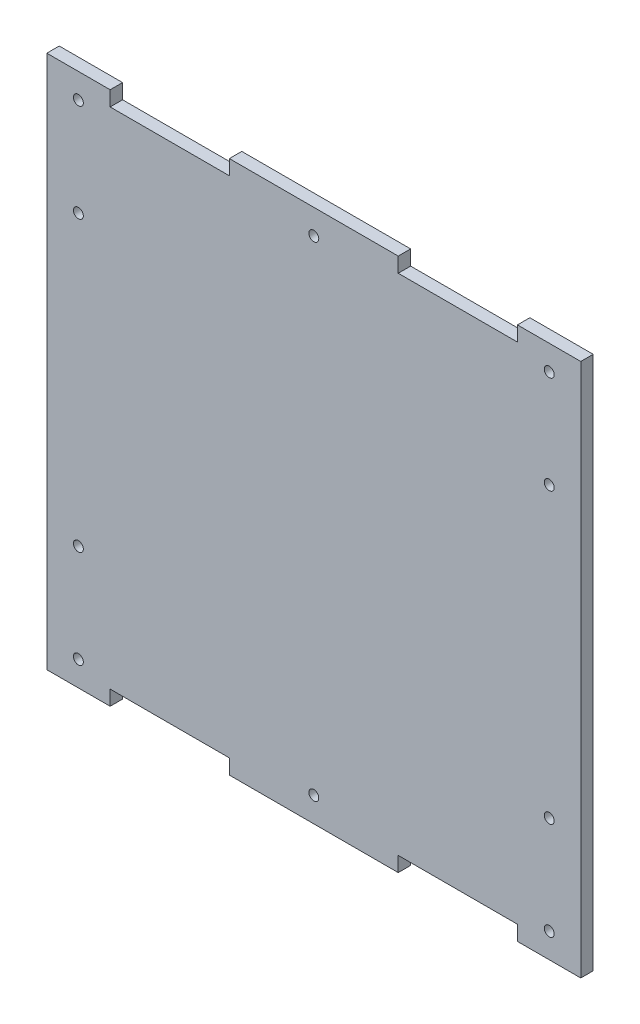
ISO-10303-21;
HEADER;
FILE_DESCRIPTION(('STEP AP214'),'2;1');
FILE_NAME('part.step','',(''),(''),'','','');
FILE_SCHEMA(('AUTOMOTIVE_DESIGN { 1 0 10303 214 1 1 1 1 }'));
ENDSEC;
DATA;
#1=APPLICATION_CONTEXT('core data for automotive mechanical design processes');
#2=APPLICATION_PROTOCOL_DEFINITION('international standard','automotive_design',2000,#1);
#3=PRODUCT_CONTEXT('',#1,'mechanical');
#4=PRODUCT('Part','Part','',(#3));
#5=PRODUCT_RELATED_PRODUCT_CATEGORY('part','',(#4));
#6=PRODUCT_DEFINITION_FORMATION('','',#4);
#7=PRODUCT_DEFINITION_CONTEXT('part definition',#1,'design');
#8=PRODUCT_DEFINITION('design','',#6,#7);
#9=PRODUCT_DEFINITION_SHAPE('','',#8);
#10=(LENGTH_UNIT() NAMED_UNIT(*) SI_UNIT(.MILLI.,.METRE.));
#11=(NAMED_UNIT(*) PLANE_ANGLE_UNIT() SI_UNIT($,.RADIAN.));
#12=(NAMED_UNIT(*) SI_UNIT($,.STERADIAN.) SOLID_ANGLE_UNIT());
#13=UNCERTAINTY_MEASURE_WITH_UNIT(LENGTH_MEASURE(1.E-05),#10,'distance_accuracy_value','');
#14=(GEOMETRIC_REPRESENTATION_CONTEXT(3) GLOBAL_UNCERTAINTY_ASSIGNED_CONTEXT((#13)) GLOBAL_UNIT_ASSIGNED_CONTEXT((#10,
#11,#12)) REPRESENTATION_CONTEXT('',''));
#15=CARTESIAN_POINT('',(0.,0.,0.));
#16=DIRECTION('',(0.,0.,1.));
#17=DIRECTION('',(1.,0.,0.));
#18=AXIS2_PLACEMENT_3D('',#15,#16,#17);
#19=CARTESIAN_POINT('',(-136.525,-136.525,6.35));
#20=DIRECTION('',(0.,1.,0.));
#21=DIRECTION('',(0.,0.,1.));
#22=AXIS2_PLACEMENT_3D('',#19,#20,#21);
#23=PLANE('',#22);
#24=DIRECTION('',(1.,0.,0.));
#25=VECTOR('',#24,1.);
#26=CARTESIAN_POINT('',(-136.525,-136.525,0.));
#27=LINE('',#26,#25);
#28=CARTESIAN_POINT('',(-43.1799999999999,-136.525,0.));
#29=VERTEX_POINT('',#28);
#30=CARTESIAN_POINT('',(43.18,-136.525,0.));
#31=VERTEX_POINT('',#30);
#32=EDGE_CURVE('E349',#29,#31,#27,.T.);
#33=ORIENTED_EDGE('',*,*,#32,.T.);
#34=DIRECTION('',(0.,0.,1.));
#35=VECTOR('',#34,1.);
#36=CARTESIAN_POINT('',(43.18,-136.525,6.35));
#37=LINE('',#36,#35);
#38=CARTESIAN_POINT('',(43.18,-136.525,6.35));
#39=VERTEX_POINT('',#38);
#40=EDGE_CURVE('E11',#31,#39,#37,.T.);
#41=ORIENTED_EDGE('',*,*,#40,.T.);
#42=DIRECTION('',(1.,0.,0.));
#43=VECTOR('',#42,1.);
#44=CARTESIAN_POINT('',(-136.525,-136.525,6.35));
#45=LINE('',#44,#43);
#46=CARTESIAN_POINT('',(-43.1799999999999,-136.525,6.35));
#47=VERTEX_POINT('',#46);
#48=EDGE_CURVE('E337',#47,#39,#45,.T.);
#49=ORIENTED_EDGE('',*,*,#48,.F.);
#50=DIRECTION('',(0.,0.,-1.));
#51=VECTOR('',#50,1.);
#52=CARTESIAN_POINT('',(-43.1799999999999,-136.525,6.35));
#53=LINE('',#52,#51);
#54=EDGE_CURVE('E373',#47,#29,#53,.T.);
#55=ORIENTED_EDGE('',*,*,#54,.T.);
#56=EDGE_LOOP('',(#33,#41,#49,#55));
#57=FACE_BOUND('',#56,.T.);
#58=ADVANCED_FACE('F31',(#57),#23,.F.);
#59=CARTESIAN_POINT('',(-136.525,-136.525,0.));
#60=VERTEX_POINT('',#59);
#61=CARTESIAN_POINT('',(-104.14,-136.525,0.));
#62=VERTEX_POINT('',#61);
#63=EDGE_CURVE('E325',#60,#62,#27,.T.);
#64=ORIENTED_EDGE('',*,*,#63,.T.);
#65=DIRECTION('',(0.,0.,1.));
#66=VECTOR('',#65,1.);
#67=CARTESIAN_POINT('',(-104.14,-136.525,6.35));
#68=LINE('',#67,#66);
#69=CARTESIAN_POINT('',(-104.14,-136.525,6.35));
#70=VERTEX_POINT('',#69);
#71=EDGE_CURVE('E375',#62,#70,#68,.T.);
#72=ORIENTED_EDGE('',*,*,#71,.T.);
#73=CARTESIAN_POINT('',(-136.525,-136.525,6.35));
#74=VERTEX_POINT('',#73);
#75=EDGE_CURVE('E333',#74,#70,#45,.T.);
#76=ORIENTED_EDGE('',*,*,#75,.F.);
#77=DIRECTION('',(0.,0.,-1.));
#78=VECTOR('',#77,1.);
#79=CARTESIAN_POINT('',(-136.525,-136.525,6.35));
#80=LINE('',#79,#78);
#81=EDGE_CURVE('E352',#74,#60,#80,.T.);
#82=ORIENTED_EDGE('',*,*,#81,.T.);
#83=EDGE_LOOP('',(#64,#72,#76,#82));
#84=FACE_BOUND('',#83,.T.);
#85=ADVANCED_FACE('F404',(#84),#23,.F.);
#86=CARTESIAN_POINT('',(-136.525,136.525,6.35));
#87=DIRECTION('',(0.,-1.,0.));
#88=DIRECTION('',(0.,0.,-1.));
#89=AXIS2_PLACEMENT_3D('',#86,#87,#88);
#90=PLANE('',#89);
#91=DIRECTION('',(-1.,0.,0.));
#92=VECTOR('',#91,1.);
#93=CARTESIAN_POINT('',(-136.525,136.525,0.));
#94=LINE('',#93,#92);
#95=CARTESIAN_POINT('',(136.525,136.525,0.));
#96=VERTEX_POINT('',#95);
#97=CARTESIAN_POINT('',(104.14,136.525,0.));
#98=VERTEX_POINT('',#97);
#99=EDGE_CURVE('E341',#96,#98,#94,.T.);
#100=ORIENTED_EDGE('',*,*,#99,.T.);
#101=DIRECTION('',(0.,0.,1.));
#102=VECTOR('',#101,1.);
#103=CARTESIAN_POINT('',(104.14,136.525,6.35));
#104=LINE('',#103,#102);
#105=CARTESIAN_POINT('',(104.14,136.525,6.35));
#106=VERTEX_POINT('',#105);
#107=EDGE_CURVE('E370',#98,#106,#104,.T.);
#108=ORIENTED_EDGE('',*,*,#107,.T.);
#109=DIRECTION('',(-1.,0.,0.));
#110=VECTOR('',#109,1.);
#111=CARTESIAN_POINT('',(-136.525,136.525,6.35));
#112=LINE('',#111,#110);
#113=CARTESIAN_POINT('',(136.525,136.525,6.35));
#114=VERTEX_POINT('',#113);
#115=EDGE_CURVE('E326',#114,#106,#112,.T.);
#116=ORIENTED_EDGE('',*,*,#115,.F.);
#117=DIRECTION('',(0.,0.,-1.));
#118=VECTOR('',#117,1.);
#119=CARTESIAN_POINT('',(136.525,136.525,6.35));
#120=LINE('',#119,#118);
#121=EDGE_CURVE('E358',#114,#96,#120,.T.);
#122=ORIENTED_EDGE('',*,*,#121,.T.);
#123=EDGE_LOOP('',(#100,#108,#116,#122));
#124=FACE_BOUND('',#123,.T.);
#125=ADVANCED_FACE('F439',(#124),#90,.F.);
#126=CARTESIAN_POINT('',(-104.14,136.525,6.35));
#127=VERTEX_POINT('',#126);
#128=CARTESIAN_POINT('',(-136.525,136.525,6.35));
#129=VERTEX_POINT('',#128);
#130=EDGE_CURVE('E324',#127,#129,#112,.T.);
#131=ORIENTED_EDGE('',*,*,#130,.F.);
#132=DIRECTION('',(0.,0.,-1.));
#133=VECTOR('',#132,1.);
#134=CARTESIAN_POINT('',(-104.14,136.525,6.35));
#135=LINE('',#134,#133);
#136=CARTESIAN_POINT('',(-104.14,136.525,0.));
#137=VERTEX_POINT('',#136);
#138=EDGE_CURVE('E364',#127,#137,#135,.T.);
#139=ORIENTED_EDGE('',*,*,#138,.T.);
#140=CARTESIAN_POINT('',(-136.525,136.525,0.));
#141=VERTEX_POINT('',#140);
#142=EDGE_CURVE('E340',#137,#141,#94,.T.);
#143=ORIENTED_EDGE('',*,*,#142,.T.);
#144=DIRECTION('',(0.,0.,-1.));
#145=VECTOR('',#144,1.);
#146=CARTESIAN_POINT('',(-136.525,136.525,6.35));
#147=LINE('',#146,#145);
#148=EDGE_CURVE('E355',#129,#141,#147,.T.);
#149=ORIENTED_EDGE('',*,*,#148,.F.);
#150=EDGE_LOOP('',(#131,#139,#143,#149));
#151=FACE_BOUND('',#150,.T.);
#152=ADVANCED_FACE('F472',(#151),#90,.F.);
#153=CARTESIAN_POINT('',(136.525,136.525,6.35));
#154=DIRECTION('',(0.,0.,-1.));
#155=DIRECTION('',(-1.,0.,0.));
#156=AXIS2_PLACEMENT_3D('',#153,#154,#155);
#157=PLANE('',#156);
#158=CARTESIAN_POINT('',(-120.396,-73.787,6.35));
#159=DIRECTION('',(0.,0.,1.));
#160=DIRECTION('',(-1.,0.,0.));
#161=AXIS2_PLACEMENT_3D('',#158,#159,#160);
#162=CIRCLE('',#161,2.53999999999999);
#163=CARTESIAN_POINT('',(-122.936,-73.787,6.35));
#164=VERTEX_POINT('',#163);
#165=EDGE_CURVE('E267',#164,#164,#162,.T.);
#166=ORIENTED_EDGE('',*,*,#165,.F.);
#167=EDGE_LOOP('',(#166));
#168=FACE_BOUND('',#167,.T.);
#169=CARTESIAN_POINT('',(120.396,-73.787,6.35));
#170=DIRECTION('',(0.,0.,1.));
#171=DIRECTION('',(1.,0.,0.));
#172=AXIS2_PLACEMENT_3D('',#169,#170,#171);
#173=CIRCLE('',#172,2.53999999999999);
#174=CARTESIAN_POINT('',(122.936,-73.787,6.35));
#175=VERTEX_POINT('',#174);
#176=EDGE_CURVE('E279',#175,#175,#173,.T.);
#177=ORIENTED_EDGE('',*,*,#176,.F.);
#178=EDGE_LOOP('',(#177));
#179=FACE_BOUND('',#178,.T.);
#180=CARTESIAN_POINT('',(120.396,123.825,6.35));
#181=DIRECTION('',(0.,0.,1.));
#182=DIRECTION('',(-1.,0.,0.));
#183=AXIS2_PLACEMENT_3D('',#180,#181,#182);
#184=CIRCLE('',#183,2.53999999999999);
#185=CARTESIAN_POINT('',(117.856,123.825,6.35));
#186=VERTEX_POINT('',#185);
#187=EDGE_CURVE('E291',#186,#186,#184,.T.);
#188=ORIENTED_EDGE('',*,*,#187,.F.);
#189=EDGE_LOOP('',(#188));
#190=FACE_BOUND('',#189,.T.);
#191=CARTESIAN_POINT('',(0.,123.825,6.35));
#192=DIRECTION('',(0.,0.,1.));
#193=DIRECTION('',(1.,0.,0.));
#194=AXIS2_PLACEMENT_3D('',#191,#192,#193);
#195=CIRCLE('',#194,2.54);
#196=CARTESIAN_POINT('',(2.54,123.825,6.35));
#197=VERTEX_POINT('',#196);
#198=EDGE_CURVE('E303',#197,#197,#195,.T.);
#199=ORIENTED_EDGE('',*,*,#198,.F.);
#200=EDGE_LOOP('',(#199));
#201=FACE_BOUND('',#200,.T.);
#202=CARTESIAN_POINT('',(-120.396,123.825,6.35));
#203=DIRECTION('',(0.,0.,1.));
#204=DIRECTION('',(1.,0.,0.));
#205=AXIS2_PLACEMENT_3D('',#202,#203,#204);
#206=CIRCLE('',#205,2.53999999999999);
#207=CARTESIAN_POINT('',(-117.856,123.825,6.35));
#208=VERTEX_POINT('',#207);
#209=EDGE_CURVE('E315',#208,#208,#206,.T.);
#210=ORIENTED_EDGE('',*,*,#209,.F.);
#211=EDGE_LOOP('',(#210));
#212=FACE_BOUND('',#211,.T.);
#213=ORIENTED_EDGE('',*,*,#48,.T.);
#214=DIRECTION('',(0.,-1.,0.));
#215=VECTOR('',#214,1.);
#216=CARTESIAN_POINT('',(43.18,-128.905,6.35));
#217=LINE('',#216,#215);
#218=CARTESIAN_POINT('',(43.18,-128.905,6.35));
#219=VERTEX_POINT('',#218);
#220=EDGE_CURVE('E189',#219,#39,#217,.T.);
#221=ORIENTED_EDGE('',*,*,#220,.F.);
#222=DIRECTION('',(-1.,0.,0.));
#223=VECTOR('',#222,1.);
#224=CARTESIAN_POINT('',(104.14,-128.905,6.35));
#225=LINE('',#224,#223);
#226=CARTESIAN_POINT('',(104.14,-128.905,6.35));
#227=VERTEX_POINT('',#226);
#228=EDGE_CURVE('E191',#227,#219,#225,.T.);
#229=ORIENTED_EDGE('',*,*,#228,.F.);
#230=DIRECTION('',(0.,1.,0.));
#231=VECTOR('',#230,1.);
#232=CARTESIAN_POINT('',(104.14,-146.185059867203,6.35));
#233=LINE('',#232,#231);
#234=CARTESIAN_POINT('',(104.14,-136.525,6.35));
#235=VERTEX_POINT('',#234);
#236=EDGE_CURVE('E170',#235,#227,#233,.T.);
#237=ORIENTED_EDGE('',*,*,#236,.F.);
#238=CARTESIAN_POINT('',(136.525,-136.525,6.35));
#239=VERTEX_POINT('',#238);
#240=EDGE_CURVE('E332',#235,#239,#45,.T.);
#241=ORIENTED_EDGE('',*,*,#240,.T.);
#242=DIRECTION('',(0.,1.,0.));
#243=VECTOR('',#242,1.);
#244=CARTESIAN_POINT('',(136.525,-136.525,6.35));
#245=LINE('',#244,#243);
#246=EDGE_CURVE('E321',#239,#114,#245,.T.);
#247=ORIENTED_EDGE('',*,*,#246,.T.);
#248=ORIENTED_EDGE('',*,*,#115,.T.);
#249=DIRECTION('',(0.,1.,0.));
#250=VECTOR('',#249,1.);
#251=CARTESIAN_POINT('',(104.14,146.185059867203,6.35));
#252=LINE('',#251,#250);
#253=CARTESIAN_POINT('',(104.14,128.905,6.35));
#254=VERTEX_POINT('',#253);
#255=EDGE_CURVE('E215',#254,#106,#252,.T.);
#256=ORIENTED_EDGE('',*,*,#255,.F.);
#257=DIRECTION('',(1.,0.,0.));
#258=VECTOR('',#257,1.);
#259=CARTESIAN_POINT('',(104.14,128.905,6.35));
#260=LINE('',#259,#258);
#261=CARTESIAN_POINT('',(43.18,128.905,6.35));
#262=VERTEX_POINT('',#261);
#263=EDGE_CURVE('E222',#262,#254,#260,.T.);
#264=ORIENTED_EDGE('',*,*,#263,.F.);
#265=DIRECTION('',(0.,-1.,0.));
#266=VECTOR('',#265,1.);
#267=CARTESIAN_POINT('',(43.18,128.905,6.35));
#268=LINE('',#267,#266);
#269=CARTESIAN_POINT('',(43.18,136.525,6.35));
#270=VERTEX_POINT('',#269);
#271=EDGE_CURVE('E230',#270,#262,#268,.T.);
#272=ORIENTED_EDGE('',*,*,#271,.F.);
#273=CARTESIAN_POINT('',(-43.18,136.525,6.35));
#274=VERTEX_POINT('',#273);
#275=EDGE_CURVE('E330',#270,#274,#112,.T.);
#276=ORIENTED_EDGE('',*,*,#275,.T.);
#277=DIRECTION('',(0.,1.,0.));
#278=VECTOR('',#277,1.);
#279=CARTESIAN_POINT('',(-43.18,128.905,6.35));
#280=LINE('',#279,#278);
#281=CARTESIAN_POINT('',(-43.18,128.905,6.35));
#282=VERTEX_POINT('',#281);
#283=EDGE_CURVE('E252',#282,#274,#280,.T.);
#284=ORIENTED_EDGE('',*,*,#283,.F.);
#285=DIRECTION('',(1.,0.,0.));
#286=VECTOR('',#285,1.);
#287=CARTESIAN_POINT('',(-104.14,128.905,6.35));
#288=LINE('',#287,#286);
#289=CARTESIAN_POINT('',(-104.14,128.905,6.35));
#290=VERTEX_POINT('',#289);
#291=EDGE_CURVE('E236',#290,#282,#288,.T.);
#292=ORIENTED_EDGE('',*,*,#291,.F.);
#293=DIRECTION('',(0.,-1.,0.));
#294=VECTOR('',#293,1.);
#295=CARTESIAN_POINT('',(-104.14,146.185059867203,6.35));
#296=LINE('',#295,#294);
#297=EDGE_CURVE('E243',#127,#290,#296,.T.);
#298=ORIENTED_EDGE('',*,*,#297,.F.);
#299=ORIENTED_EDGE('',*,*,#130,.T.);
#300=DIRECTION('',(0.,-1.,0.));
#301=VECTOR('',#300,1.);
#302=CARTESIAN_POINT('',(-136.525,-136.525,6.35));
#303=LINE('',#302,#301);
#304=EDGE_CURVE('E329',#129,#74,#303,.T.);
#305=ORIENTED_EDGE('',*,*,#304,.T.);
#306=ORIENTED_EDGE('',*,*,#75,.T.);
#307=DIRECTION('',(0.,-1.,0.));
#308=VECTOR('',#307,1.);
#309=CARTESIAN_POINT('',(-104.14,-146.185059867203,6.35));
#310=LINE('',#309,#308);
#311=CARTESIAN_POINT('',(-104.14,-128.905,6.35));
#312=VERTEX_POINT('',#311);
#313=EDGE_CURVE('E197',#312,#70,#310,.T.);
#314=ORIENTED_EDGE('',*,*,#313,.F.);
#315=DIRECTION('',(-1.,0.,0.));
#316=VECTOR('',#315,1.);
#317=CARTESIAN_POINT('',(-104.14,-128.905,6.35));
#318=LINE('',#317,#316);
#319=CARTESIAN_POINT('',(-43.1799999999999,-128.905,6.35));
#320=VERTEX_POINT('',#319);
#321=EDGE_CURVE('E202',#320,#312,#318,.T.);
#322=ORIENTED_EDGE('',*,*,#321,.F.);
#323=DIRECTION('',(0.,1.,0.));
#324=VECTOR('',#323,1.);
#325=CARTESIAN_POINT('',(-43.1799999999999,-128.905,6.35));
#326=LINE('',#325,#324);
#327=EDGE_CURVE('E209',#47,#320,#326,.T.);
#328=ORIENTED_EDGE('',*,*,#327,.F.);
#329=EDGE_LOOP('',(#213,#221,#229,#237,#241,#247,#248,#256,#264,#272,#276,#284,#292,#298,#299,
#305,#306,#314,#322,#328));
#330=FACE_BOUND('',#329,.T.);
#331=CARTESIAN_POINT('',(-120.396,73.787,6.35));
#332=DIRECTION('',(0.,0.,1.));
#333=DIRECTION('',(1.,0.,0.));
#334=AXIS2_PLACEMENT_3D('',#331,#332,#333);
#335=CIRCLE('',#334,2.53999999999999);
#336=CARTESIAN_POINT('',(-117.856,73.787,6.35));
#337=VERTEX_POINT('',#336);
#338=EDGE_CURVE('E309',#337,#337,#335,.T.);
#339=ORIENTED_EDGE('',*,*,#338,.F.);
#340=EDGE_LOOP('',(#339));
#341=FACE_BOUND('',#340,.T.);
#342=CARTESIAN_POINT('',(120.396,73.787,6.35));
#343=DIRECTION('',(0.,0.,1.));
#344=DIRECTION('',(-1.,0.,0.));
#345=AXIS2_PLACEMENT_3D('',#342,#343,#344);
#346=CIRCLE('',#345,2.53999999999999);
#347=CARTESIAN_POINT('',(117.856,73.787,6.35));
#348=VERTEX_POINT('',#347);
#349=EDGE_CURVE('E297',#348,#348,#346,.T.);
#350=ORIENTED_EDGE('',*,*,#349,.F.);
#351=EDGE_LOOP('',(#350));
#352=FACE_BOUND('',#351,.T.);
#353=CARTESIAN_POINT('',(120.396,-123.825,6.35));
#354=DIRECTION('',(0.,0.,1.));
#355=DIRECTION('',(1.,0.,0.));
#356=AXIS2_PLACEMENT_3D('',#353,#354,#355);
#357=CIRCLE('',#356,2.53999999999999);
#358=CARTESIAN_POINT('',(122.936,-123.825,6.35));
#359=VERTEX_POINT('',#358);
#360=EDGE_CURVE('E285',#359,#359,#357,.T.);
#361=ORIENTED_EDGE('',*,*,#360,.F.);
#362=EDGE_LOOP('',(#361));
#363=FACE_BOUND('',#362,.T.);
#364=CARTESIAN_POINT('',(0.,-123.825,6.35));
#365=DIRECTION('',(0.,0.,1.));
#366=DIRECTION('',(-1.,0.,0.));
#367=AXIS2_PLACEMENT_3D('',#364,#365,#366);
#368=CIRCLE('',#367,2.54);
#369=CARTESIAN_POINT('',(-2.54,-123.825,6.35));
#370=VERTEX_POINT('',#369);
#371=EDGE_CURVE('E273',#370,#370,#368,.T.);
#372=ORIENTED_EDGE('',*,*,#371,.F.);
#373=EDGE_LOOP('',(#372));
#374=FACE_BOUND('',#373,.T.);
#375=CARTESIAN_POINT('',(-120.396,-123.825,6.35));
#376=DIRECTION('',(0.,0.,1.));
#377=DIRECTION('',(-1.,0.,0.));
#378=AXIS2_PLACEMENT_3D('',#375,#376,#377);
#379=CIRCLE('',#378,2.53999999999999);
#380=CARTESIAN_POINT('',(-122.936,-123.825,6.35));
#381=VERTEX_POINT('',#380);
#382=EDGE_CURVE('E261',#381,#381,#379,.T.);
#383=ORIENTED_EDGE('',*,*,#382,.F.);
#384=EDGE_LOOP('',(#383));
#385=FACE_BOUND('',#384,.T.);
#386=ADVANCED_FACE('F383',(#168,#179,#190,#201,#212,#330,#341,#352,#363,#374,#385),#157,.F.);
#387=CARTESIAN_POINT('',(136.525,136.525,0.));
#388=DIRECTION('',(0.,0.,-1.));
#389=DIRECTION('',(-1.,0.,0.));
#390=AXIS2_PLACEMENT_3D('',#387,#388,#389);
#391=PLANE('',#390);
#392=DIRECTION('',(0.,-1.,0.));
#393=VECTOR('',#392,1.);
#394=CARTESIAN_POINT('',(43.18,-128.905,0.));
#395=LINE('',#394,#393);
#396=CARTESIAN_POINT('',(43.18,-128.905,0.));
#397=VERTEX_POINT('',#396);
#398=EDGE_CURVE('E175',#397,#31,#395,.T.);
#399=ORIENTED_EDGE('',*,*,#398,.T.);
#400=ORIENTED_EDGE('',*,*,#32,.F.);
#401=DIRECTION('',(0.,1.,0.));
#402=VECTOR('',#401,1.);
#403=CARTESIAN_POINT('',(-43.1799999999999,-128.905,0.));
#404=LINE('',#403,#402);
#405=CARTESIAN_POINT('',(-43.1799999999999,-128.905,0.));
#406=VERTEX_POINT('',#405);
#407=EDGE_CURVE('E54',#29,#406,#404,.T.);
#408=ORIENTED_EDGE('',*,*,#407,.T.);
#409=DIRECTION('',(-1.,0.,0.));
#410=VECTOR('',#409,1.);
#411=CARTESIAN_POINT('',(-104.14,-128.905,0.));
#412=LINE('',#411,#410);
#413=CARTESIAN_POINT('',(-104.14,-128.905,0.));
#414=VERTEX_POINT('',#413);
#415=EDGE_CURVE('E204',#406,#414,#412,.T.);
#416=ORIENTED_EDGE('',*,*,#415,.T.);
#417=DIRECTION('',(0.,-1.,0.));
#418=VECTOR('',#417,1.);
#419=CARTESIAN_POINT('',(-104.14,-146.185059867203,0.));
#420=LINE('',#419,#418);
#421=EDGE_CURVE('E199',#414,#62,#420,.T.);
#422=ORIENTED_EDGE('',*,*,#421,.T.);
#423=ORIENTED_EDGE('',*,*,#63,.F.);
#424=DIRECTION('',(0.,-1.,0.));
#425=VECTOR('',#424,1.);
#426=CARTESIAN_POINT('',(-136.525,-136.525,0.));
#427=LINE('',#426,#425);
#428=EDGE_CURVE('E344',#141,#60,#427,.T.);
#429=ORIENTED_EDGE('',*,*,#428,.F.);
#430=ORIENTED_EDGE('',*,*,#142,.F.);
#431=DIRECTION('',(0.,-1.,0.));
#432=VECTOR('',#431,1.);
#433=CARTESIAN_POINT('',(-104.14,146.185059867203,0.));
#434=LINE('',#433,#432);
#435=CARTESIAN_POINT('',(-104.14,128.905,0.));
#436=VERTEX_POINT('',#435);
#437=EDGE_CURVE('E246',#137,#436,#434,.T.);
#438=ORIENTED_EDGE('',*,*,#437,.T.);
#439=DIRECTION('',(1.,0.,0.));
#440=VECTOR('',#439,1.);
#441=CARTESIAN_POINT('',(-104.14,128.905,0.));
#442=LINE('',#441,#440);
#443=CARTESIAN_POINT('',(-43.18,128.905,0.));
#444=VERTEX_POINT('',#443);
#445=EDGE_CURVE('E239',#436,#444,#442,.T.);
#446=ORIENTED_EDGE('',*,*,#445,.T.);
#447=DIRECTION('',(0.,1.,0.));
#448=VECTOR('',#447,1.);
#449=CARTESIAN_POINT('',(-43.18,128.905,0.));
#450=LINE('',#449,#448);
#451=CARTESIAN_POINT('',(-43.18,136.525,0.));
#452=VERTEX_POINT('',#451);
#453=EDGE_CURVE('E242',#444,#452,#450,.T.);
#454=ORIENTED_EDGE('',*,*,#453,.T.);
#455=CARTESIAN_POINT('',(43.18,136.525,0.));
#456=VERTEX_POINT('',#455);
#457=EDGE_CURVE('E345',#456,#452,#94,.T.);
#458=ORIENTED_EDGE('',*,*,#457,.F.);
#459=DIRECTION('',(0.,-1.,0.));
#460=VECTOR('',#459,1.);
#461=CARTESIAN_POINT('',(43.18,128.905,0.));
#462=LINE('',#461,#460);
#463=CARTESIAN_POINT('',(43.18,128.905,0.));
#464=VERTEX_POINT('',#463);
#465=EDGE_CURVE('E221',#456,#464,#462,.T.);
#466=ORIENTED_EDGE('',*,*,#465,.T.);
#467=DIRECTION('',(1.,0.,0.));
#468=VECTOR('',#467,1.);
#469=CARTESIAN_POINT('',(104.14,128.905,0.));
#470=LINE('',#469,#468);
#471=CARTESIAN_POINT('',(104.14,128.905,0.));
#472=VERTEX_POINT('',#471);
#473=EDGE_CURVE('E225',#464,#472,#470,.T.);
#474=ORIENTED_EDGE('',*,*,#473,.T.);
#475=DIRECTION('',(0.,1.,0.));
#476=VECTOR('',#475,1.);
#477=CARTESIAN_POINT('',(104.14,146.185059867203,0.));
#478=LINE('',#477,#476);
#479=EDGE_CURVE('E218',#472,#98,#478,.T.);
#480=ORIENTED_EDGE('',*,*,#479,.T.);
#481=ORIENTED_EDGE('',*,*,#99,.F.);
#482=DIRECTION('',(0.,1.,0.));
#483=VECTOR('',#482,1.);
#484=CARTESIAN_POINT('',(136.525,-136.525,0.));
#485=LINE('',#484,#483);
#486=CARTESIAN_POINT('',(136.525,-136.525,0.));
#487=VERTEX_POINT('',#486);
#488=EDGE_CURVE('E318',#487,#96,#485,.T.);
#489=ORIENTED_EDGE('',*,*,#488,.F.);
#490=CARTESIAN_POINT('',(104.14,-136.525,0.));
#491=VERTEX_POINT('',#490);
#492=EDGE_CURVE('E188',#491,#487,#27,.T.);
#493=ORIENTED_EDGE('',*,*,#492,.F.);
#494=DIRECTION('',(0.,1.,0.));
#495=VECTOR('',#494,1.);
#496=CARTESIAN_POINT('',(104.14,-146.185059867203,0.));
#497=LINE('',#496,#495);
#498=CARTESIAN_POINT('',(104.14,-128.905,0.));
#499=VERTEX_POINT('',#498);
#500=EDGE_CURVE('E46',#491,#499,#497,.T.);
#501=ORIENTED_EDGE('',*,*,#500,.T.);
#502=DIRECTION('',(-1.,0.,0.));
#503=VECTOR('',#502,1.);
#504=CARTESIAN_POINT('',(104.14,-128.905,0.));
#505=LINE('',#504,#503);
#506=EDGE_CURVE('E178',#499,#397,#505,.T.);
#507=ORIENTED_EDGE('',*,*,#506,.T.);
#508=EDGE_LOOP('',(#399,#400,#408,#416,#422,#423,#429,#430,#438,#446,#454,#458,#466,#474,#480,
#481,#489,#493,#501,#507));
#509=FACE_BOUND('',#508,.T.);
#510=CARTESIAN_POINT('',(-120.396,-73.787,0.));
#511=DIRECTION('',(0.,0.,1.));
#512=DIRECTION('',(-1.,0.,0.));
#513=AXIS2_PLACEMENT_3D('',#510,#511,#512);
#514=CIRCLE('',#513,2.53999999999999);
#515=CARTESIAN_POINT('',(-122.936,-73.787,0.));
#516=VERTEX_POINT('',#515);
#517=EDGE_CURVE('E264',#516,#516,#514,.T.);
#518=ORIENTED_EDGE('',*,*,#517,.T.);
#519=EDGE_LOOP('',(#518));
#520=FACE_BOUND('',#519,.T.);
#521=CARTESIAN_POINT('',(120.396,-73.787,0.));
#522=DIRECTION('',(0.,0.,1.));
#523=DIRECTION('',(1.,0.,0.));
#524=AXIS2_PLACEMENT_3D('',#521,#522,#523);
#525=CIRCLE('',#524,2.53999999999999);
#526=CARTESIAN_POINT('',(122.936,-73.787,0.));
#527=VERTEX_POINT('',#526);
#528=EDGE_CURVE('E276',#527,#527,#525,.T.);
#529=ORIENTED_EDGE('',*,*,#528,.T.);
#530=EDGE_LOOP('',(#529));
#531=FACE_BOUND('',#530,.T.);
#532=CARTESIAN_POINT('',(120.396,123.825,0.));
#533=DIRECTION('',(0.,0.,1.));
#534=DIRECTION('',(-1.,0.,0.));
#535=AXIS2_PLACEMENT_3D('',#532,#533,#534);
#536=CIRCLE('',#535,2.53999999999999);
#537=CARTESIAN_POINT('',(117.856,123.825,0.));
#538=VERTEX_POINT('',#537);
#539=EDGE_CURVE('E288',#538,#538,#536,.T.);
#540=ORIENTED_EDGE('',*,*,#539,.T.);
#541=EDGE_LOOP('',(#540));
#542=FACE_BOUND('',#541,.T.);
#543=CARTESIAN_POINT('',(0.,123.825,0.));
#544=DIRECTION('',(0.,0.,1.));
#545=DIRECTION('',(1.,0.,0.));
#546=AXIS2_PLACEMENT_3D('',#543,#544,#545);
#547=CIRCLE('',#546,2.54);
#548=CARTESIAN_POINT('',(2.54,123.825,0.));
#549=VERTEX_POINT('',#548);
#550=EDGE_CURVE('E300',#549,#549,#547,.T.);
#551=ORIENTED_EDGE('',*,*,#550,.T.);
#552=EDGE_LOOP('',(#551));
#553=FACE_BOUND('',#552,.T.);
#554=CARTESIAN_POINT('',(-120.396,123.825,0.));
#555=DIRECTION('',(0.,0.,1.));
#556=DIRECTION('',(1.,0.,0.));
#557=AXIS2_PLACEMENT_3D('',#554,#555,#556);
#558=CIRCLE('',#557,2.53999999999999);
#559=CARTESIAN_POINT('',(-117.856,123.825,0.));
#560=VERTEX_POINT('',#559);
#561=EDGE_CURVE('E312',#560,#560,#558,.T.);
#562=ORIENTED_EDGE('',*,*,#561,.T.);
#563=EDGE_LOOP('',(#562));
#564=FACE_BOUND('',#563,.T.);
#565=CARTESIAN_POINT('',(-120.396,73.787,0.));
#566=DIRECTION('',(0.,0.,1.));
#567=DIRECTION('',(1.,0.,0.));
#568=AXIS2_PLACEMENT_3D('',#565,#566,#567);
#569=CIRCLE('',#568,2.53999999999999);
#570=CARTESIAN_POINT('',(-117.856,73.787,0.));
#571=VERTEX_POINT('',#570);
#572=EDGE_CURVE('E306',#571,#571,#569,.T.);
#573=ORIENTED_EDGE('',*,*,#572,.T.);
#574=EDGE_LOOP('',(#573));
#575=FACE_BOUND('',#574,.T.);
#576=CARTESIAN_POINT('',(120.396,73.787,0.));
#577=DIRECTION('',(0.,0.,1.));
#578=DIRECTION('',(-1.,0.,0.));
#579=AXIS2_PLACEMENT_3D('',#576,#577,#578);
#580=CIRCLE('',#579,2.53999999999999);
#581=CARTESIAN_POINT('',(117.856,73.787,0.));
#582=VERTEX_POINT('',#581);
#583=EDGE_CURVE('E294',#582,#582,#580,.T.);
#584=ORIENTED_EDGE('',*,*,#583,.T.);
#585=EDGE_LOOP('',(#584));
#586=FACE_BOUND('',#585,.T.);
#587=CARTESIAN_POINT('',(120.396,-123.825,0.));
#588=DIRECTION('',(0.,0.,1.));
#589=DIRECTION('',(1.,0.,0.));
#590=AXIS2_PLACEMENT_3D('',#587,#588,#589);
#591=CIRCLE('',#590,2.53999999999999);
#592=CARTESIAN_POINT('',(122.936,-123.825,0.));
#593=VERTEX_POINT('',#592);
#594=EDGE_CURVE('E282',#593,#593,#591,.T.);
#595=ORIENTED_EDGE('',*,*,#594,.T.);
#596=EDGE_LOOP('',(#595));
#597=FACE_BOUND('',#596,.T.);
#598=CARTESIAN_POINT('',(0.,-123.825,0.));
#599=DIRECTION('',(0.,0.,1.));
#600=DIRECTION('',(-1.,0.,0.));
#601=AXIS2_PLACEMENT_3D('',#598,#599,#600);
#602=CIRCLE('',#601,2.54);
#603=CARTESIAN_POINT('',(-2.54,-123.825,0.));
#604=VERTEX_POINT('',#603);
#605=EDGE_CURVE('E270',#604,#604,#602,.T.);
#606=ORIENTED_EDGE('',*,*,#605,.T.);
#607=EDGE_LOOP('',(#606));
#608=FACE_BOUND('',#607,.T.);
#609=CARTESIAN_POINT('',(-120.396,-123.825,0.));
#610=DIRECTION('',(0.,0.,1.));
#611=DIRECTION('',(-1.,0.,0.));
#612=AXIS2_PLACEMENT_3D('',#609,#610,#611);
#613=CIRCLE('',#612,2.53999999999999);
#614=CARTESIAN_POINT('',(-122.936,-123.825,0.));
#615=VERTEX_POINT('',#614);
#616=EDGE_CURVE('E259',#615,#615,#613,.T.);
#617=ORIENTED_EDGE('',*,*,#616,.T.);
#618=EDGE_LOOP('',(#617));
#619=FACE_BOUND('',#618,.T.);
#620=ADVANCED_FACE('F185',(#509,#520,#531,#542,#553,#564,#575,#586,#597,#608,#619),#391,.T.);
#621=CARTESIAN_POINT('',(136.525,-136.525,6.35));
#622=DIRECTION('',(-1.,0.,0.));
#623=DIRECTION('',(0.,0.,1.));
#624=AXIS2_PLACEMENT_3D('',#621,#622,#623);
#625=PLANE('',#624);
#626=ORIENTED_EDGE('',*,*,#488,.T.);
#627=ORIENTED_EDGE('',*,*,#121,.F.);
#628=ORIENTED_EDGE('',*,*,#246,.F.);
#629=DIRECTION('',(0.,0.,-1.));
#630=VECTOR('',#629,1.);
#631=CARTESIAN_POINT('',(136.525,-136.525,6.35));
#632=LINE('',#631,#630);
#633=EDGE_CURVE('E336',#239,#487,#632,.T.);
#634=ORIENTED_EDGE('',*,*,#633,.T.);
#635=EDGE_LOOP('',(#626,#627,#628,#634));
#636=FACE_BOUND('',#635,.T.);
#637=ADVANCED_FACE('F33',(#636),#625,.F.);
#638=ORIENTED_EDGE('',*,*,#275,.F.);
#639=DIRECTION('',(0.,0.,-1.));
#640=VECTOR('',#639,1.);
#641=CARTESIAN_POINT('',(43.18,136.525,6.35));
#642=LINE('',#641,#640);
#643=EDGE_CURVE('E367',#270,#456,#642,.T.);
#644=ORIENTED_EDGE('',*,*,#643,.T.);
#645=ORIENTED_EDGE('',*,*,#457,.T.);
#646=DIRECTION('',(0.,0.,1.));
#647=VECTOR('',#646,1.);
#648=CARTESIAN_POINT('',(-43.18,136.525,6.35));
#649=LINE('',#648,#647);
#650=EDGE_CURVE('E361',#452,#274,#649,.T.);
#651=ORIENTED_EDGE('',*,*,#650,.T.);
#652=EDGE_LOOP('',(#638,#644,#645,#651));
#653=FACE_BOUND('',#652,.T.);
#654=ADVANCED_FACE('F419',(#653),#90,.F.);
#655=CARTESIAN_POINT('',(-136.525,-136.525,6.35));
#656=DIRECTION('',(1.,0.,0.));
#657=DIRECTION('',(0.,0.,-1.));
#658=AXIS2_PLACEMENT_3D('',#655,#656,#657);
#659=PLANE('',#658);
#660=ORIENTED_EDGE('',*,*,#428,.T.);
#661=ORIENTED_EDGE('',*,*,#81,.F.);
#662=ORIENTED_EDGE('',*,*,#304,.F.);
#663=ORIENTED_EDGE('',*,*,#148,.T.);
#664=EDGE_LOOP('',(#660,#661,#662,#663));
#665=FACE_BOUND('',#664,.T.);
#666=ADVANCED_FACE('F411',(#665),#659,.F.);
#667=ORIENTED_EDGE('',*,*,#240,.F.);
#668=DIRECTION('',(0.,0.,-1.));
#669=VECTOR('',#668,1.);
#670=CARTESIAN_POINT('',(104.14,-136.525,6.35));
#671=LINE('',#670,#669);
#672=EDGE_CURVE('E39',#235,#491,#671,.T.);
#673=ORIENTED_EDGE('',*,*,#672,.T.);
#674=ORIENTED_EDGE('',*,*,#492,.T.);
#675=ORIENTED_EDGE('',*,*,#633,.F.);
#676=EDGE_LOOP('',(#667,#673,#674,#675));
#677=FACE_BOUND('',#676,.T.);
#678=ADVANCED_FACE('F379',(#677),#23,.F.);
#679=CARTESIAN_POINT('',(-120.396,123.825,6.35));
#680=DIRECTION('',(0.,0.,-1.));
#681=DIRECTION('',(-1.,0.,0.));
#682=AXIS2_PLACEMENT_3D('',#679,#680,#681);
#683=CYLINDRICAL_SURFACE('',#682,2.53999999999999);
#684=ORIENTED_EDGE('',*,*,#209,.T.);
#685=EDGE_LOOP('',(#684));
#686=FACE_BOUND('',#685,.T.);
#687=ORIENTED_EDGE('',*,*,#561,.F.);
#688=EDGE_LOOP('',(#687));
#689=FACE_BOUND('',#688,.T.);
#690=ADVANCED_FACE('F461',(#686,#689),#683,.F.);
#691=CARTESIAN_POINT('',(-120.396,73.787,6.35));
#692=DIRECTION('',(0.,0.,-1.));
#693=DIRECTION('',(-1.,0.,0.));
#694=AXIS2_PLACEMENT_3D('',#691,#692,#693);
#695=CYLINDRICAL_SURFACE('',#694,2.53999999999999);
#696=ORIENTED_EDGE('',*,*,#338,.T.);
#697=EDGE_LOOP('',(#696));
#698=FACE_BOUND('',#697,.T.);
#699=ORIENTED_EDGE('',*,*,#572,.F.);
#700=EDGE_LOOP('',(#699));
#701=FACE_BOUND('',#700,.T.);
#702=ADVANCED_FACE('F466',(#698,#701),#695,.F.);
#703=CARTESIAN_POINT('',(0.,123.825,6.35));
#704=DIRECTION('',(0.,0.,-1.));
#705=DIRECTION('',(-1.,0.,0.));
#706=AXIS2_PLACEMENT_3D('',#703,#704,#705);
#707=CYLINDRICAL_SURFACE('',#706,2.54);
#708=ORIENTED_EDGE('',*,*,#198,.T.);
#709=EDGE_LOOP('',(#708));
#710=FACE_BOUND('',#709,.T.);
#711=ORIENTED_EDGE('',*,*,#550,.F.);
#712=EDGE_LOOP('',(#711));
#713=FACE_BOUND('',#712,.T.);
#714=ADVANCED_FACE('F518',(#710,#713),#707,.F.);
#715=CARTESIAN_POINT('',(120.396,73.787,6.35));
#716=DIRECTION('',(0.,0.,-1.));
#717=DIRECTION('',(-1.,0.,0.));
#718=AXIS2_PLACEMENT_3D('',#715,#716,#717);
#719=CYLINDRICAL_SURFACE('',#718,2.53999999999999);
#720=ORIENTED_EDGE('',*,*,#349,.T.);
#721=EDGE_LOOP('',(#720));
#722=FACE_BOUND('',#721,.T.);
#723=ORIENTED_EDGE('',*,*,#583,.F.);
#724=EDGE_LOOP('',(#723));
#725=FACE_BOUND('',#724,.T.);
#726=ADVANCED_FACE('F514',(#722,#725),#719,.F.);
#727=CARTESIAN_POINT('',(120.396,123.825,6.35));
#728=DIRECTION('',(0.,0.,-1.));
#729=DIRECTION('',(-1.,0.,0.));
#730=AXIS2_PLACEMENT_3D('',#727,#728,#729);
#731=CYLINDRICAL_SURFACE('',#730,2.53999999999999);
#732=ORIENTED_EDGE('',*,*,#187,.T.);
#733=EDGE_LOOP('',(#732));
#734=FACE_BOUND('',#733,.T.);
#735=ORIENTED_EDGE('',*,*,#539,.F.);
#736=EDGE_LOOP('',(#735));
#737=FACE_BOUND('',#736,.T.);
#738=ADVANCED_FACE('F510',(#734,#737),#731,.F.);
#739=CARTESIAN_POINT('',(120.396,-123.825,6.35));
#740=DIRECTION('',(0.,0.,-1.));
#741=DIRECTION('',(-1.,0.,0.));
#742=AXIS2_PLACEMENT_3D('',#739,#740,#741);
#743=CYLINDRICAL_SURFACE('',#742,2.53999999999999);
#744=ORIENTED_EDGE('',*,*,#360,.T.);
#745=EDGE_LOOP('',(#744));
#746=FACE_BOUND('',#745,.T.);
#747=ORIENTED_EDGE('',*,*,#594,.F.);
#748=EDGE_LOOP('',(#747));
#749=FACE_BOUND('',#748,.T.);
#750=ADVANCED_FACE('F506',(#746,#749),#743,.F.);
#751=CARTESIAN_POINT('',(120.396,-73.787,6.35));
#752=DIRECTION('',(0.,0.,-1.));
#753=DIRECTION('',(-1.,0.,0.));
#754=AXIS2_PLACEMENT_3D('',#751,#752,#753);
#755=CYLINDRICAL_SURFACE('',#754,2.53999999999999);
#756=ORIENTED_EDGE('',*,*,#176,.T.);
#757=EDGE_LOOP('',(#756));
#758=FACE_BOUND('',#757,.T.);
#759=ORIENTED_EDGE('',*,*,#528,.F.);
#760=EDGE_LOOP('',(#759));
#761=FACE_BOUND('',#760,.T.);
#762=ADVANCED_FACE('F502',(#758,#761),#755,.F.);
#763=CARTESIAN_POINT('',(0.,-123.825,6.35));
#764=DIRECTION('',(0.,0.,-1.));
#765=DIRECTION('',(-1.,0.,0.));
#766=AXIS2_PLACEMENT_3D('',#763,#764,#765);
#767=CYLINDRICAL_SURFACE('',#766,2.54);
#768=ORIENTED_EDGE('',*,*,#371,.T.);
#769=EDGE_LOOP('',(#768));
#770=FACE_BOUND('',#769,.T.);
#771=ORIENTED_EDGE('',*,*,#605,.F.);
#772=EDGE_LOOP('',(#771));
#773=FACE_BOUND('',#772,.T.);
#774=ADVANCED_FACE('F498',(#770,#773),#767,.F.);
#775=CARTESIAN_POINT('',(-120.396,-73.787,6.35));
#776=DIRECTION('',(0.,0.,-1.));
#777=DIRECTION('',(-1.,0.,0.));
#778=AXIS2_PLACEMENT_3D('',#775,#776,#777);
#779=CYLINDRICAL_SURFACE('',#778,2.53999999999999);
#780=ORIENTED_EDGE('',*,*,#165,.T.);
#781=EDGE_LOOP('',(#780));
#782=FACE_BOUND('',#781,.T.);
#783=ORIENTED_EDGE('',*,*,#517,.F.);
#784=EDGE_LOOP('',(#783));
#785=FACE_BOUND('',#784,.T.);
#786=ADVANCED_FACE('F492',(#782,#785),#779,.F.);
#787=CARTESIAN_POINT('',(-120.396,-123.825,6.35));
#788=DIRECTION('',(0.,0.,-1.));
#789=DIRECTION('',(-1.,0.,0.));
#790=AXIS2_PLACEMENT_3D('',#787,#788,#789);
#791=CYLINDRICAL_SURFACE('',#790,2.53999999999999);
#792=ORIENTED_EDGE('',*,*,#382,.T.);
#793=EDGE_LOOP('',(#792));
#794=FACE_BOUND('',#793,.T.);
#795=ORIENTED_EDGE('',*,*,#616,.F.);
#796=EDGE_LOOP('',(#795));
#797=FACE_BOUND('',#796,.T.);
#798=ADVANCED_FACE('F486',(#794,#797),#791,.F.);
#799=CARTESIAN_POINT('',(-104.14,146.185059867203,0.));
#800=DIRECTION('',(-1.,0.,0.));
#801=DIRECTION('',(0.,0.,1.));
#802=AXIS2_PLACEMENT_3D('',#799,#800,#801);
#803=PLANE('',#802);
#804=ORIENTED_EDGE('',*,*,#297,.T.);
#805=DIRECTION('',(0.,0.,1.));
#806=VECTOR('',#805,1.);
#807=CARTESIAN_POINT('',(-104.14,128.905,0.));
#808=LINE('',#807,#806);
#809=EDGE_CURVE('E256',#436,#290,#808,.T.);
#810=ORIENTED_EDGE('',*,*,#809,.F.);
#811=ORIENTED_EDGE('',*,*,#437,.F.);
#812=ORIENTED_EDGE('',*,*,#138,.F.);
#813=EDGE_LOOP('',(#804,#810,#811,#812));
#814=FACE_BOUND('',#813,.T.);
#815=ADVANCED_FACE('F484',(#814),#803,.F.);
#816=CARTESIAN_POINT('',(-43.18,128.905,0.));
#817=DIRECTION('',(1.,0.,0.));
#818=DIRECTION('',(0.,1.,0.));
#819=AXIS2_PLACEMENT_3D('',#816,#817,#818);
#820=PLANE('',#819);
#821=ORIENTED_EDGE('',*,*,#453,.F.);
#822=DIRECTION('',(0.,0.,1.));
#823=VECTOR('',#822,1.);
#824=CARTESIAN_POINT('',(-43.18,128.905,0.));
#825=LINE('',#824,#823);
#826=EDGE_CURVE('E249',#444,#282,#825,.T.);
#827=ORIENTED_EDGE('',*,*,#826,.T.);
#828=ORIENTED_EDGE('',*,*,#283,.T.);
#829=ORIENTED_EDGE('',*,*,#650,.F.);
#830=EDGE_LOOP('',(#821,#827,#828,#829));
#831=FACE_BOUND('',#830,.T.);
#832=ADVANCED_FACE('F422',(#831),#820,.F.);
#833=CARTESIAN_POINT('',(-104.14,128.905,0.));
#834=DIRECTION('',(0.,-1.,0.));
#835=DIRECTION('',(0.,0.,-1.));
#836=AXIS2_PLACEMENT_3D('',#833,#834,#835);
#837=PLANE('',#836);
#838=ORIENTED_EDGE('',*,*,#291,.T.);
#839=ORIENTED_EDGE('',*,*,#826,.F.);
#840=ORIENTED_EDGE('',*,*,#445,.F.);
#841=ORIENTED_EDGE('',*,*,#809,.T.);
#842=EDGE_LOOP('',(#838,#839,#840,#841));
#843=FACE_BOUND('',#842,.T.);
#844=ADVANCED_FACE('F426',(#843),#837,.F.);
#845=CARTESIAN_POINT('',(104.14,146.185059867203,0.));
#846=DIRECTION('',(1.,0.,0.));
#847=DIRECTION('',(0.,0.,-1.));
#848=AXIS2_PLACEMENT_3D('',#845,#846,#847);
#849=PLANE('',#848);
#850=ORIENTED_EDGE('',*,*,#479,.F.);
#851=DIRECTION('',(0.,0.,1.));
#852=VECTOR('',#851,1.);
#853=CARTESIAN_POINT('',(104.14,128.905,0.));
#854=LINE('',#853,#852);
#855=EDGE_CURVE('E234',#472,#254,#854,.T.);
#856=ORIENTED_EDGE('',*,*,#855,.T.);
#857=ORIENTED_EDGE('',*,*,#255,.T.);
#858=ORIENTED_EDGE('',*,*,#107,.F.);
#859=EDGE_LOOP('',(#850,#856,#857,#858));
#860=FACE_BOUND('',#859,.T.);
#861=ADVANCED_FACE('F443',(#860),#849,.F.);
#862=CARTESIAN_POINT('',(43.18,128.905,0.));
#863=DIRECTION('',(-1.,0.,0.));
#864=DIRECTION('',(0.,0.,1.));
#865=AXIS2_PLACEMENT_3D('',#862,#863,#864);
#866=PLANE('',#865);
#867=ORIENTED_EDGE('',*,*,#271,.T.);
#868=DIRECTION('',(0.,0.,1.));
#869=VECTOR('',#868,1.);
#870=CARTESIAN_POINT('',(43.18,128.905,0.));
#871=LINE('',#870,#869);
#872=EDGE_CURVE('E228',#464,#262,#871,.T.);
#873=ORIENTED_EDGE('',*,*,#872,.F.);
#874=ORIENTED_EDGE('',*,*,#465,.F.);
#875=ORIENTED_EDGE('',*,*,#643,.F.);
#876=EDGE_LOOP('',(#867,#873,#874,#875));
#877=FACE_BOUND('',#876,.T.);
#878=ADVANCED_FACE('F432',(#877),#866,.F.);
#879=CARTESIAN_POINT('',(104.14,128.905,0.));
#880=DIRECTION('',(0.,-1.,0.));
#881=DIRECTION('',(1.,0.,0.));
#882=AXIS2_PLACEMENT_3D('',#879,#880,#881);
#883=PLANE('',#882);
#884=ORIENTED_EDGE('',*,*,#263,.T.);
#885=ORIENTED_EDGE('',*,*,#855,.F.);
#886=ORIENTED_EDGE('',*,*,#473,.F.);
#887=ORIENTED_EDGE('',*,*,#872,.T.);
#888=EDGE_LOOP('',(#884,#885,#886,#887));
#889=FACE_BOUND('',#888,.T.);
#890=ADVANCED_FACE('F435',(#889),#883,.F.);
#891=CARTESIAN_POINT('',(-104.14,-146.185059867203,0.));
#892=DIRECTION('',(-1.,0.,0.));
#893=DIRECTION('',(0.,0.,1.));
#894=AXIS2_PLACEMENT_3D('',#891,#892,#893);
#895=PLANE('',#894);
#896=ORIENTED_EDGE('',*,*,#421,.F.);
#897=DIRECTION('',(0.,0.,1.));
#898=VECTOR('',#897,1.);
#899=CARTESIAN_POINT('',(-104.14,-128.905,0.));
#900=LINE('',#899,#898);
#901=EDGE_CURVE('E213',#414,#312,#900,.T.);
#902=ORIENTED_EDGE('',*,*,#901,.T.);
#903=ORIENTED_EDGE('',*,*,#313,.T.);
#904=ORIENTED_EDGE('',*,*,#71,.F.);
#905=EDGE_LOOP('',(#896,#902,#903,#904));
#906=FACE_BOUND('',#905,.T.);
#907=ADVANCED_FACE('F401',(#906),#895,.F.);
#908=CARTESIAN_POINT('',(-43.1799999999999,-128.905,0.));
#909=DIRECTION('',(1.,0.,0.));
#910=DIRECTION('',(0.,0.,-1.));
#911=AXIS2_PLACEMENT_3D('',#908,#909,#910);
#912=PLANE('',#911);
#913=ORIENTED_EDGE('',*,*,#327,.T.);
#914=DIRECTION('',(0.,0.,1.));
#915=VECTOR('',#914,1.);
#916=CARTESIAN_POINT('',(-43.1799999999999,-128.905,0.));
#917=LINE('',#916,#915);
#918=EDGE_CURVE('E207',#406,#320,#917,.T.);
#919=ORIENTED_EDGE('',*,*,#918,.F.);
#920=ORIENTED_EDGE('',*,*,#407,.F.);
#921=ORIENTED_EDGE('',*,*,#54,.F.);
#922=EDGE_LOOP('',(#913,#919,#920,#921));
#923=FACE_BOUND('',#922,.T.);
#924=ADVANCED_FACE('F666',(#923),#912,.F.);
#925=CARTESIAN_POINT('',(-104.14,-128.905,0.));
#926=DIRECTION('',(0.,1.,0.));
#927=DIRECTION('',(-1.,0.,0.));
#928=AXIS2_PLACEMENT_3D('',#925,#926,#927);
#929=PLANE('',#928);
#930=ORIENTED_EDGE('',*,*,#321,.T.);
#931=ORIENTED_EDGE('',*,*,#901,.F.);
#932=ORIENTED_EDGE('',*,*,#415,.F.);
#933=ORIENTED_EDGE('',*,*,#918,.T.);
#934=EDGE_LOOP('',(#930,#931,#932,#933));
#935=FACE_BOUND('',#934,.T.);
#936=ADVANCED_FACE('F397',(#935),#929,.F.);
#937=CARTESIAN_POINT('',(43.18,-128.905,0.));
#938=DIRECTION('',(-1.,0.,0.));
#939=DIRECTION('',(0.,0.,1.));
#940=AXIS2_PLACEMENT_3D('',#937,#938,#939);
#941=PLANE('',#940);
#942=ORIENTED_EDGE('',*,*,#398,.F.);
#943=DIRECTION('',(0.,0.,1.));
#944=VECTOR('',#943,1.);
#945=CARTESIAN_POINT('',(43.18,-128.905,0.));
#946=LINE('',#945,#944);
#947=EDGE_CURVE('E174',#397,#219,#946,.T.);
#948=ORIENTED_EDGE('',*,*,#947,.T.);
#949=ORIENTED_EDGE('',*,*,#220,.T.);
#950=ORIENTED_EDGE('',*,*,#40,.F.);
#951=EDGE_LOOP('',(#942,#948,#949,#950));
#952=FACE_BOUND('',#951,.T.);
#953=ADVANCED_FACE('F389',(#952),#941,.F.);
#954=CARTESIAN_POINT('',(104.14,-146.185059867203,0.));
#955=DIRECTION('',(1.,0.,0.));
#956=DIRECTION('',(0.,0.,-1.));
#957=AXIS2_PLACEMENT_3D('',#954,#955,#956);
#958=PLANE('',#957);
#959=ORIENTED_EDGE('',*,*,#236,.T.);
#960=DIRECTION('',(0.,0.,1.));
#961=VECTOR('',#960,1.);
#962=CARTESIAN_POINT('',(104.14,-128.905,0.));
#963=LINE('',#962,#961);
#964=EDGE_CURVE('E166',#499,#227,#963,.T.);
#965=ORIENTED_EDGE('',*,*,#964,.F.);
#966=ORIENTED_EDGE('',*,*,#500,.F.);
#967=ORIENTED_EDGE('',*,*,#672,.F.);
#968=EDGE_LOOP('',(#959,#965,#966,#967));
#969=FACE_BOUND('',#968,.T.);
#970=ADVANCED_FACE('F168',(#969),#958,.F.);
#971=CARTESIAN_POINT('',(104.14,-128.905,0.));
#972=DIRECTION('',(0.,1.,0.));
#973=DIRECTION('',(-1.,0.,0.));
#974=AXIS2_PLACEMENT_3D('',#971,#972,#973);
#975=PLANE('',#974);
#976=ORIENTED_EDGE('',*,*,#228,.T.);
#977=ORIENTED_EDGE('',*,*,#947,.F.);
#978=ORIENTED_EDGE('',*,*,#506,.F.);
#979=ORIENTED_EDGE('',*,*,#964,.T.);
#980=EDGE_LOOP('',(#976,#977,#978,#979));
#981=FACE_BOUND('',#980,.T.);
#982=ADVANCED_FACE('F179',(#981),#975,.F.);
#983=CLOSED_SHELL('',(#58,#85,#125,#152,#386,#620,#637,#654,#666,#678,#690,#702,#714,#726,#738,
#750,#762,#774,#786,#798,#815,#832,#844,#861,#878,#890,#907,#924,#936,#953,#970,#982));
#984=MANIFOLD_SOLID_BREP('B2',#983);
#985=ADVANCED_BREP_SHAPE_REPRESENTATION('',(#18,#984),#14);
#986=SHAPE_DEFINITION_REPRESENTATION(#9,#985);
ENDSEC;
END-ISO-10303-21;
